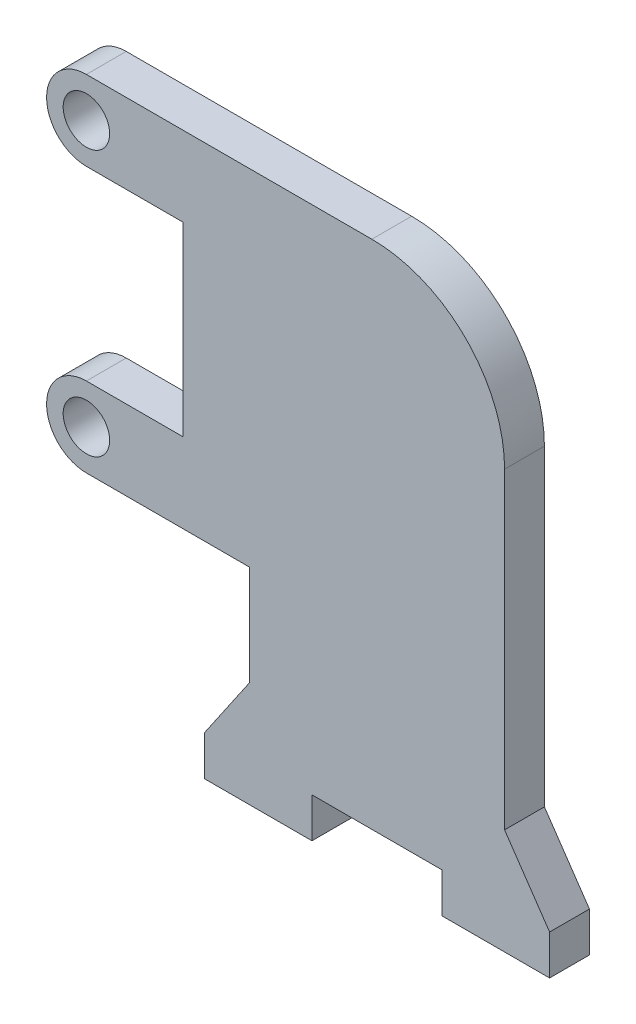
ISO-10303-21;
HEADER;
FILE_DESCRIPTION(('STEP AP214'),'2;1');
FILE_NAME('part.step','',(''),(''),'','','');
FILE_SCHEMA(('AUTOMOTIVE_DESIGN { 1 0 10303 214 1 1 1 1 }'));
ENDSEC;
DATA;
#1=APPLICATION_CONTEXT('core data for automotive mechanical design processes');
#2=APPLICATION_PROTOCOL_DEFINITION('international standard','automotive_design',2000,#1);
#3=PRODUCT_CONTEXT('',#1,'mechanical');
#4=PRODUCT('Part','Part','',(#3));
#5=PRODUCT_RELATED_PRODUCT_CATEGORY('part','',(#4));
#6=PRODUCT_DEFINITION_FORMATION('','',#4);
#7=PRODUCT_DEFINITION_CONTEXT('part definition',#1,'design');
#8=PRODUCT_DEFINITION('design','',#6,#7);
#9=PRODUCT_DEFINITION_SHAPE('','',#8);
#10=(LENGTH_UNIT() NAMED_UNIT(*) SI_UNIT(.MILLI.,.METRE.));
#11=(NAMED_UNIT(*) PLANE_ANGLE_UNIT() SI_UNIT($,.RADIAN.));
#12=(NAMED_UNIT(*) SI_UNIT($,.STERADIAN.) SOLID_ANGLE_UNIT());
#13=UNCERTAINTY_MEASURE_WITH_UNIT(LENGTH_MEASURE(1.E-05),#10,'distance_accuracy_value','');
#14=(GEOMETRIC_REPRESENTATION_CONTEXT(3) GLOBAL_UNCERTAINTY_ASSIGNED_CONTEXT((#13)) GLOBAL_UNIT_ASSIGNED_CONTEXT((#10,
#11,#12)) REPRESENTATION_CONTEXT('',''));
#15=CARTESIAN_POINT('',(0.,0.,0.));
#16=DIRECTION('',(0.,0.,1.));
#17=DIRECTION('',(1.,0.,0.));
#18=AXIS2_PLACEMENT_3D('',#15,#16,#17);
#19=CARTESIAN_POINT('',(-31.5,40.5,3.));
#20=DIRECTION('',(0.,0.,1.));
#21=DIRECTION('',(1.,0.,0.));
#22=AXIS2_PLACEMENT_3D('',#19,#20,#21);
#23=PLANE('',#22);
#24=CARTESIAN_POINT('',(-31.5,40.5,3.));
#25=DIRECTION('',(0.,0.,1.));
#26=DIRECTION('',(1.,0.,0.));
#27=AXIS2_PLACEMENT_3D('',#24,#25,#26);
#28=CIRCLE('',#27,1.75);
#29=CARTESIAN_POINT('',(-29.75,40.5,3.));
#30=VERTEX_POINT('',#29);
#31=EDGE_CURVE('E273',#30,#30,#28,.T.);
#32=ORIENTED_EDGE('',*,*,#31,.F.);
#33=EDGE_LOOP('',(#32));
#34=FACE_BOUND('',#33,.T.);
#35=DIRECTION('',(0.,1.,0.));
#36=VECTOR('',#35,1.);
#37=CARTESIAN_POINT('',(0.,43.5,3.));
#38=LINE('',#37,#36);
#39=CARTESIAN_POINT('',(0.,9.96803793212616,3.));
#40=VERTEX_POINT('',#39);
#41=CARTESIAN_POINT('',(0.,33.5,3.));
#42=VERTEX_POINT('',#41);
#43=EDGE_CURVE('E238',#40,#42,#38,.T.);
#44=ORIENTED_EDGE('',*,*,#43,.T.);
#45=CARTESIAN_POINT('',(-10.,33.5,3.));
#46=DIRECTION('',(0.,0.,1.));
#47=DIRECTION('',(1.,0.,0.));
#48=AXIS2_PLACEMENT_3D('',#45,#46,#47);
#49=CIRCLE('',#48,10.);
#50=CARTESIAN_POINT('',(-10.,43.5,3.));
#51=VERTEX_POINT('',#50);
#52=EDGE_CURVE('E11',#42,#51,#49,.T.);
#53=ORIENTED_EDGE('',*,*,#52,.T.);
#54=DIRECTION('',(-1.,0.,0.));
#55=VECTOR('',#54,1.);
#56=CARTESIAN_POINT('',(0.,43.5,3.));
#57=LINE('',#56,#55);
#58=CARTESIAN_POINT('',(-31.5,43.5,3.));
#59=VERTEX_POINT('',#58);
#60=EDGE_CURVE('E163',#51,#59,#57,.T.);
#61=ORIENTED_EDGE('',*,*,#60,.T.);
#62=CARTESIAN_POINT('',(-31.5,40.5,3.));
#63=DIRECTION('',(0.,0.,1.));
#64=DIRECTION('',(1.,0.,0.));
#65=AXIS2_PLACEMENT_3D('',#62,#63,#64);
#66=CIRCLE('',#65,3.);
#67=CARTESIAN_POINT('',(-31.5,37.5,3.));
#68=VERTEX_POINT('',#67);
#69=EDGE_CURVE('E166',#59,#68,#66,.T.);
#70=ORIENTED_EDGE('',*,*,#69,.T.);
#71=DIRECTION('',(1.,0.,0.));
#72=VECTOR('',#71,1.);
#73=CARTESIAN_POINT('',(-24.2074766361135,37.5,3.));
#74=LINE('',#73,#72);
#75=CARTESIAN_POINT('',(-24.2074766361135,37.5,3.));
#76=VERTEX_POINT('',#75);
#77=EDGE_CURVE('E182',#68,#76,#74,.T.);
#78=ORIENTED_EDGE('',*,*,#77,.T.);
#79=DIRECTION('',(0.,-1.,0.));
#80=VECTOR('',#79,1.);
#81=CARTESIAN_POINT('',(-24.2074766361135,37.5,3.));
#82=LINE('',#81,#80);
#83=CARTESIAN_POINT('',(-24.2074766361135,23.5,3.));
#84=VERTEX_POINT('',#83);
#85=EDGE_CURVE('E301',#76,#84,#82,.T.);
#86=ORIENTED_EDGE('',*,*,#85,.T.);
#87=DIRECTION('',(-1.,0.,0.));
#88=VECTOR('',#87,1.);
#89=CARTESIAN_POINT('',(-24.2074766361135,23.5,3.));
#90=LINE('',#89,#88);
#91=CARTESIAN_POINT('',(-31.5,23.5,3.));
#92=VERTEX_POINT('',#91);
#93=EDGE_CURVE('E299',#84,#92,#90,.T.);
#94=ORIENTED_EDGE('',*,*,#93,.T.);
#95=CARTESIAN_POINT('',(-31.5,20.5,3.));
#96=DIRECTION('',(0.,0.,1.));
#97=DIRECTION('',(1.,0.,0.));
#98=AXIS2_PLACEMENT_3D('',#95,#96,#97);
#99=CIRCLE('',#98,3.);
#100=CARTESIAN_POINT('',(-31.5,17.5,3.));
#101=VERTEX_POINT('',#100);
#102=EDGE_CURVE('E297',#92,#101,#99,.T.);
#103=ORIENTED_EDGE('',*,*,#102,.T.);
#104=DIRECTION('',(1.,0.,0.));
#105=VECTOR('',#104,1.);
#106=CARTESIAN_POINT('',(-31.5,17.5,3.));
#107=LINE('',#106,#105);
#108=CARTESIAN_POINT('',(-19.2101041322525,17.5,3.));
#109=VERTEX_POINT('',#108);
#110=EDGE_CURVE('E295',#101,#109,#107,.T.);
#111=ORIENTED_EDGE('',*,*,#110,.T.);
#112=DIRECTION('',(0.,-1.,0.));
#113=VECTOR('',#112,1.);
#114=CARTESIAN_POINT('',(-19.2101041322525,17.5,3.));
#115=LINE('',#114,#113);
#116=CARTESIAN_POINT('',(-19.2101041322525,9.96803793212616,3.));
#117=VERTEX_POINT('',#116);
#118=EDGE_CURVE('E293',#109,#117,#115,.T.);
#119=ORIENTED_EDGE('',*,*,#118,.T.);
#120=DIRECTION('',(-0.564776254154879,-0.825244074648697,0.));
#121=VECTOR('',#120,1.);
#122=CARTESIAN_POINT('',(-22.6101041322525,5.,3.));
#123=LINE('',#122,#121);
#124=CARTESIAN_POINT('',(-22.6101041322525,5.,3.));
#125=VERTEX_POINT('',#124);
#126=EDGE_CURVE('E291',#117,#125,#123,.T.);
#127=ORIENTED_EDGE('',*,*,#126,.T.);
#128=DIRECTION('',(0.,-1.,0.));
#129=VECTOR('',#128,1.);
#130=CARTESIAN_POINT('',(-22.6101041322525,5.,3.));
#131=LINE('',#130,#129);
#132=CARTESIAN_POINT('',(-22.6101041322525,2.,3.));
#133=VERTEX_POINT('',#132);
#134=EDGE_CURVE('E289',#125,#133,#131,.T.);
#135=ORIENTED_EDGE('',*,*,#134,.T.);
#136=DIRECTION('',(1.,0.,0.));
#137=VECTOR('',#136,1.);
#138=CARTESIAN_POINT('',(-22.6101041322525,2.,3.));
#139=LINE('',#138,#137);
#140=CARTESIAN_POINT('',(-14.5101041322525,2.,3.));
#141=VERTEX_POINT('',#140);
#142=EDGE_CURVE('E287',#133,#141,#139,.T.);
#143=ORIENTED_EDGE('',*,*,#142,.T.);
#144=DIRECTION('',(0.,1.,0.));
#145=VECTOR('',#144,1.);
#146=CARTESIAN_POINT('',(-14.5101041322525,5.,3.));
#147=LINE('',#146,#145);
#148=CARTESIAN_POINT('',(-14.5101041322525,5.,3.));
#149=VERTEX_POINT('',#148);
#150=EDGE_CURVE('E285',#141,#149,#147,.T.);
#151=ORIENTED_EDGE('',*,*,#150,.T.);
#152=DIRECTION('',(1.,0.,0.));
#153=VECTOR('',#152,1.);
#154=CARTESIAN_POINT('',(-14.5101041322525,5.,3.));
#155=LINE('',#154,#153);
#156=CARTESIAN_POINT('',(-4.71010413225247,5.,3.));
#157=VERTEX_POINT('',#156);
#158=EDGE_CURVE('E283',#149,#157,#155,.T.);
#159=ORIENTED_EDGE('',*,*,#158,.T.);
#160=DIRECTION('',(0.,-1.,0.));
#161=VECTOR('',#160,1.);
#162=CARTESIAN_POINT('',(-4.71010413225247,5.,3.));
#163=LINE('',#162,#161);
#164=CARTESIAN_POINT('',(-4.71010413225247,2.,3.));
#165=VERTEX_POINT('',#164);
#166=EDGE_CURVE('E281',#157,#165,#163,.T.);
#167=ORIENTED_EDGE('',*,*,#166,.T.);
#168=DIRECTION('',(1.,0.,0.));
#169=VECTOR('',#168,1.);
#170=CARTESIAN_POINT('',(3.38989586774753,2.,3.));
#171=LINE('',#170,#169);
#172=CARTESIAN_POINT('',(3.38989586774753,2.,3.));
#173=VERTEX_POINT('',#172);
#174=EDGE_CURVE('E279',#165,#173,#171,.T.);
#175=ORIENTED_EDGE('',*,*,#174,.T.);
#176=DIRECTION('',(0.,1.,0.));
#177=VECTOR('',#176,1.);
#178=CARTESIAN_POINT('',(3.38989586774753,5.,3.));
#179=LINE('',#178,#177);
#180=CARTESIAN_POINT('',(3.38989586774753,5.,3.));
#181=VERTEX_POINT('',#180);
#182=EDGE_CURVE('E277',#173,#181,#179,.T.);
#183=ORIENTED_EDGE('',*,*,#182,.T.);
#184=DIRECTION('',(-0.563631588100596,0.826026290680388,0.));
#185=VECTOR('',#184,1.);
#186=CARTESIAN_POINT('',(3.38989586774753,5.,3.));
#187=LINE('',#186,#185);
#188=EDGE_CURVE('E275',#181,#40,#187,.T.);
#189=ORIENTED_EDGE('',*,*,#188,.T.);
#190=EDGE_LOOP('',(#44,#53,#61,#70,#78,#86,#94,#103,#111,#119,#127,#135,#143,#151,#159,#167,
#175,#183,#189));
#191=FACE_BOUND('',#190,.T.);
#192=CARTESIAN_POINT('',(-31.5,20.5,3.));
#193=DIRECTION('',(0.,0.,1.));
#194=DIRECTION('',(1.,0.,0.));
#195=AXIS2_PLACEMENT_3D('',#192,#193,#194);
#196=CIRCLE('',#195,1.75);
#197=CARTESIAN_POINT('',(-29.75,20.5,3.));
#198=VERTEX_POINT('',#197);
#199=EDGE_CURVE('E307',#198,#198,#196,.T.);
#200=ORIENTED_EDGE('',*,*,#199,.F.);
#201=EDGE_LOOP('',(#200));
#202=FACE_BOUND('',#201,.T.);
#203=ADVANCED_FACE('F33',(#34,#191,#202),#23,.T.);
#204=CARTESIAN_POINT('',(-31.5,40.5,0.));
#205=DIRECTION('',(0.,0.,1.));
#206=DIRECTION('',(1.,0.,0.));
#207=AXIS2_PLACEMENT_3D('',#204,#205,#206);
#208=PLANE('',#207);
#209=CARTESIAN_POINT('',(-31.5,40.5,0.));
#210=DIRECTION('',(0.,0.,1.));
#211=DIRECTION('',(1.,0.,0.));
#212=AXIS2_PLACEMENT_3D('',#209,#210,#211);
#213=CIRCLE('',#212,1.75);
#214=CARTESIAN_POINT('',(-29.75,40.5,0.));
#215=VERTEX_POINT('',#214);
#216=EDGE_CURVE('E304',#215,#215,#213,.T.);
#217=ORIENTED_EDGE('',*,*,#216,.T.);
#218=EDGE_LOOP('',(#217));
#219=FACE_BOUND('',#218,.T.);
#220=DIRECTION('',(-1.,0.,0.));
#221=VECTOR('',#220,1.);
#222=CARTESIAN_POINT('',(0.,43.5,0.));
#223=LINE('',#222,#221);
#224=CARTESIAN_POINT('',(-10.,43.5,0.));
#225=VERTEX_POINT('',#224);
#226=CARTESIAN_POINT('',(-31.5,43.5,0.));
#227=VERTEX_POINT('',#226);
#228=EDGE_CURVE('E185',#225,#227,#223,.T.);
#229=ORIENTED_EDGE('',*,*,#228,.F.);
#230=CARTESIAN_POINT('',(-10.,33.5,0.));
#231=DIRECTION('',(0.,0.,1.));
#232=DIRECTION('',(1.,0.,0.));
#233=AXIS2_PLACEMENT_3D('',#230,#231,#232);
#234=CIRCLE('',#233,10.);
#235=CARTESIAN_POINT('',(0.,33.5,0.));
#236=VERTEX_POINT('',#235);
#237=EDGE_CURVE('E55',#225,#236,#234,.F.);
#238=ORIENTED_EDGE('',*,*,#237,.T.);
#239=DIRECTION('',(0.,1.,0.));
#240=VECTOR('',#239,1.);
#241=CARTESIAN_POINT('',(0.,43.5,0.));
#242=LINE('',#241,#240);
#243=CARTESIAN_POINT('',(0.,9.96803793212616,0.));
#244=VERTEX_POINT('',#243);
#245=EDGE_CURVE('E173',#244,#236,#242,.T.);
#246=ORIENTED_EDGE('',*,*,#245,.F.);
#247=DIRECTION('',(-0.563631588100596,0.826026290680388,0.));
#248=VECTOR('',#247,1.);
#249=CARTESIAN_POINT('',(3.38989586774753,5.,0.));
#250=LINE('',#249,#248);
#251=CARTESIAN_POINT('',(3.38989586774753,5.,0.));
#252=VERTEX_POINT('',#251);
#253=EDGE_CURVE('E240',#252,#244,#250,.T.);
#254=ORIENTED_EDGE('',*,*,#253,.F.);
#255=DIRECTION('',(0.,1.,0.));
#256=VECTOR('',#255,1.);
#257=CARTESIAN_POINT('',(3.38989586774753,5.,0.));
#258=LINE('',#257,#256);
#259=CARTESIAN_POINT('',(3.38989586774753,2.,0.));
#260=VERTEX_POINT('',#259);
#261=EDGE_CURVE('E242',#260,#252,#258,.T.);
#262=ORIENTED_EDGE('',*,*,#261,.F.);
#263=DIRECTION('',(1.,0.,0.));
#264=VECTOR('',#263,1.);
#265=CARTESIAN_POINT('',(3.38989586774753,2.,0.));
#266=LINE('',#265,#264);
#267=CARTESIAN_POINT('',(-4.71010413225247,2.,0.));
#268=VERTEX_POINT('',#267);
#269=EDGE_CURVE('E244',#268,#260,#266,.T.);
#270=ORIENTED_EDGE('',*,*,#269,.F.);
#271=DIRECTION('',(0.,-1.,0.));
#272=VECTOR('',#271,1.);
#273=CARTESIAN_POINT('',(-4.71010413225247,5.,0.));
#274=LINE('',#273,#272);
#275=CARTESIAN_POINT('',(-4.71010413225247,5.,0.));
#276=VERTEX_POINT('',#275);
#277=EDGE_CURVE('E246',#276,#268,#274,.T.);
#278=ORIENTED_EDGE('',*,*,#277,.F.);
#279=DIRECTION('',(1.,0.,0.));
#280=VECTOR('',#279,1.);
#281=CARTESIAN_POINT('',(-14.5101041322525,5.,0.));
#282=LINE('',#281,#280);
#283=CARTESIAN_POINT('',(-14.5101041322525,5.,0.));
#284=VERTEX_POINT('',#283);
#285=EDGE_CURVE('E248',#284,#276,#282,.T.);
#286=ORIENTED_EDGE('',*,*,#285,.F.);
#287=DIRECTION('',(0.,1.,0.));
#288=VECTOR('',#287,1.);
#289=CARTESIAN_POINT('',(-14.5101041322525,5.,0.));
#290=LINE('',#289,#288);
#291=CARTESIAN_POINT('',(-14.5101041322525,2.,0.));
#292=VERTEX_POINT('',#291);
#293=EDGE_CURVE('E250',#292,#284,#290,.T.);
#294=ORIENTED_EDGE('',*,*,#293,.F.);
#295=DIRECTION('',(1.,0.,0.));
#296=VECTOR('',#295,1.);
#297=CARTESIAN_POINT('',(-22.6101041322525,2.,0.));
#298=LINE('',#297,#296);
#299=CARTESIAN_POINT('',(-22.6101041322525,2.,0.));
#300=VERTEX_POINT('',#299);
#301=EDGE_CURVE('E252',#300,#292,#298,.T.);
#302=ORIENTED_EDGE('',*,*,#301,.F.);
#303=DIRECTION('',(0.,-1.,0.));
#304=VECTOR('',#303,1.);
#305=CARTESIAN_POINT('',(-22.6101041322525,5.,0.));
#306=LINE('',#305,#304);
#307=CARTESIAN_POINT('',(-22.6101041322525,5.,0.));
#308=VERTEX_POINT('',#307);
#309=EDGE_CURVE('E254',#308,#300,#306,.T.);
#310=ORIENTED_EDGE('',*,*,#309,.F.);
#311=DIRECTION('',(-0.564776254154879,-0.825244074648697,0.));
#312=VECTOR('',#311,1.);
#313=CARTESIAN_POINT('',(-22.6101041322525,5.,0.));
#314=LINE('',#313,#312);
#315=CARTESIAN_POINT('',(-19.2101041322525,9.96803793212616,0.));
#316=VERTEX_POINT('',#315);
#317=EDGE_CURVE('E256',#316,#308,#314,.T.);
#318=ORIENTED_EDGE('',*,*,#317,.F.);
#319=DIRECTION('',(0.,-1.,0.));
#320=VECTOR('',#319,1.);
#321=CARTESIAN_POINT('',(-19.2101041322525,17.5,0.));
#322=LINE('',#321,#320);
#323=CARTESIAN_POINT('',(-19.2101041322525,17.5,0.));
#324=VERTEX_POINT('',#323);
#325=EDGE_CURVE('E258',#324,#316,#322,.T.);
#326=ORIENTED_EDGE('',*,*,#325,.F.);
#327=DIRECTION('',(1.,0.,0.));
#328=VECTOR('',#327,1.);
#329=CARTESIAN_POINT('',(-31.5,17.5,0.));
#330=LINE('',#329,#328);
#331=CARTESIAN_POINT('',(-31.5,17.5,0.));
#332=VERTEX_POINT('',#331);
#333=EDGE_CURVE('E260',#332,#324,#330,.T.);
#334=ORIENTED_EDGE('',*,*,#333,.F.);
#335=CARTESIAN_POINT('',(-31.5,20.5,0.));
#336=DIRECTION('',(0.,0.,1.));
#337=DIRECTION('',(1.,0.,0.));
#338=AXIS2_PLACEMENT_3D('',#335,#336,#337);
#339=CIRCLE('',#338,3.);
#340=CARTESIAN_POINT('',(-31.5,23.5,0.));
#341=VERTEX_POINT('',#340);
#342=EDGE_CURVE('E262',#341,#332,#339,.T.);
#343=ORIENTED_EDGE('',*,*,#342,.F.);
#344=DIRECTION('',(-1.,0.,0.));
#345=VECTOR('',#344,1.);
#346=CARTESIAN_POINT('',(-24.2074766361135,23.5,0.));
#347=LINE('',#346,#345);
#348=CARTESIAN_POINT('',(-24.2074766361135,23.5,0.));
#349=VERTEX_POINT('',#348);
#350=EDGE_CURVE('E264',#349,#341,#347,.T.);
#351=ORIENTED_EDGE('',*,*,#350,.F.);
#352=DIRECTION('',(0.,-1.,0.));
#353=VECTOR('',#352,1.);
#354=CARTESIAN_POINT('',(-24.2074766361135,37.5,0.));
#355=LINE('',#354,#353);
#356=CARTESIAN_POINT('',(-24.2074766361135,37.5,0.));
#357=VERTEX_POINT('',#356);
#358=EDGE_CURVE('E266',#357,#349,#355,.T.);
#359=ORIENTED_EDGE('',*,*,#358,.F.);
#360=DIRECTION('',(1.,0.,0.));
#361=VECTOR('',#360,1.);
#362=CARTESIAN_POINT('',(-24.2074766361135,37.5,0.));
#363=LINE('',#362,#361);
#364=CARTESIAN_POINT('',(-31.5,37.5,0.));
#365=VERTEX_POINT('',#364);
#366=EDGE_CURVE('E268',#365,#357,#363,.T.);
#367=ORIENTED_EDGE('',*,*,#366,.F.);
#368=CARTESIAN_POINT('',(-31.5,40.5,0.));
#369=DIRECTION('',(0.,0.,1.));
#370=DIRECTION('',(1.,0.,0.));
#371=AXIS2_PLACEMENT_3D('',#368,#369,#370);
#372=CIRCLE('',#371,3.);
#373=EDGE_CURVE('E270',#227,#365,#372,.T.);
#374=ORIENTED_EDGE('',*,*,#373,.F.);
#375=EDGE_LOOP('',(#229,#238,#246,#254,#262,#270,#278,#286,#294,#302,#310,#318,#326,#334,#343,
#351,#359,#367,#374));
#376=FACE_BOUND('',#375,.T.);
#377=CARTESIAN_POINT('',(-31.5,20.5,0.));
#378=DIRECTION('',(0.,0.,1.));
#379=DIRECTION('',(1.,0.,0.));
#380=AXIS2_PLACEMENT_3D('',#377,#378,#379);
#381=CIRCLE('',#380,1.75);
#382=CARTESIAN_POINT('',(-29.75,20.5,0.));
#383=VERTEX_POINT('',#382);
#384=EDGE_CURVE('E310',#383,#383,#381,.T.);
#385=ORIENTED_EDGE('',*,*,#384,.T.);
#386=EDGE_LOOP('',(#385));
#387=FACE_BOUND('',#386,.T.);
#388=ADVANCED_FACE('F319',(#219,#376,#387),#208,.F.);
#389=CARTESIAN_POINT('',(0.,43.5,3.));
#390=DIRECTION('',(0.,-1.,0.));
#391=DIRECTION('',(1.,0.,0.));
#392=AXIS2_PLACEMENT_3D('',#389,#390,#391);
#393=PLANE('',#392);
#394=ORIENTED_EDGE('',*,*,#60,.F.);
#395=DIRECTION('',(0.,0.,-1.));
#396=VECTOR('',#395,1.);
#397=CARTESIAN_POINT('',(-10.,43.5,3.));
#398=LINE('',#397,#396);
#399=EDGE_CURVE('E187',#51,#225,#398,.T.);
#400=ORIENTED_EDGE('',*,*,#399,.T.);
#401=ORIENTED_EDGE('',*,*,#228,.T.);
#402=DIRECTION('',(0.,0.,-1.));
#403=VECTOR('',#402,1.);
#404=CARTESIAN_POINT('',(-31.5,43.5,3.));
#405=LINE('',#404,#403);
#406=EDGE_CURVE('E178',#59,#227,#405,.T.);
#407=ORIENTED_EDGE('',*,*,#406,.F.);
#408=EDGE_LOOP('',(#394,#400,#401,#407));
#409=FACE_BOUND('',#408,.T.);
#410=ADVANCED_FACE('F184',(#409),#393,.F.);
#411=CARTESIAN_POINT('',(-31.5,40.5,3.));
#412=DIRECTION('',(0.,0.,-1.));
#413=DIRECTION('',(-1.,0.,0.));
#414=AXIS2_PLACEMENT_3D('',#411,#412,#413);
#415=CYLINDRICAL_SURFACE('',#414,3.);
#416=ORIENTED_EDGE('',*,*,#373,.T.);
#417=DIRECTION('',(0.,0.,-1.));
#418=VECTOR('',#417,1.);
#419=CARTESIAN_POINT('',(-31.5,37.5,3.));
#420=LINE('',#419,#418);
#421=EDGE_CURVE('E180',#68,#365,#420,.T.);
#422=ORIENTED_EDGE('',*,*,#421,.F.);
#423=ORIENTED_EDGE('',*,*,#69,.F.);
#424=ORIENTED_EDGE('',*,*,#406,.T.);
#425=EDGE_LOOP('',(#416,#422,#423,#424));
#426=FACE_BOUND('',#425,.T.);
#427=ADVANCED_FACE('F177',(#426),#415,.T.);
#428=CARTESIAN_POINT('',(-24.2074766361135,37.5,3.));
#429=DIRECTION('',(0.,1.,0.));
#430=DIRECTION('',(-1.,0.,0.));
#431=AXIS2_PLACEMENT_3D('',#428,#429,#430);
#432=PLANE('',#431);
#433=ORIENTED_EDGE('',*,*,#366,.T.);
#434=DIRECTION('',(0.,0.,-1.));
#435=VECTOR('',#434,1.);
#436=CARTESIAN_POINT('',(-24.2074766361135,37.5,3.));
#437=LINE('',#436,#435);
#438=EDGE_CURVE('E190',#76,#357,#437,.T.);
#439=ORIENTED_EDGE('',*,*,#438,.F.);
#440=ORIENTED_EDGE('',*,*,#77,.F.);
#441=ORIENTED_EDGE('',*,*,#421,.T.);
#442=EDGE_LOOP('',(#433,#439,#440,#441));
#443=FACE_BOUND('',#442,.T.);
#444=ADVANCED_FACE('F390',(#443),#432,.F.);
#445=CARTESIAN_POINT('',(-24.2074766361135,37.5,3.));
#446=DIRECTION('',(1.,0.,0.));
#447=DIRECTION('',(0.,0.,-1.));
#448=AXIS2_PLACEMENT_3D('',#445,#446,#447);
#449=PLANE('',#448);
#450=ORIENTED_EDGE('',*,*,#358,.T.);
#451=DIRECTION('',(0.,0.,-1.));
#452=VECTOR('',#451,1.);
#453=CARTESIAN_POINT('',(-24.2074766361135,23.5,3.));
#454=LINE('',#453,#452);
#455=EDGE_CURVE('E196',#84,#349,#454,.T.);
#456=ORIENTED_EDGE('',*,*,#455,.F.);
#457=ORIENTED_EDGE('',*,*,#85,.F.);
#458=ORIENTED_EDGE('',*,*,#438,.T.);
#459=EDGE_LOOP('',(#450,#456,#457,#458));
#460=FACE_BOUND('',#459,.T.);
#461=ADVANCED_FACE('F386',(#460),#449,.F.);
#462=CARTESIAN_POINT('',(-24.2074766361135,23.5,3.));
#463=DIRECTION('',(0.,-1.,0.));
#464=DIRECTION('',(0.,0.,-1.));
#465=AXIS2_PLACEMENT_3D('',#462,#463,#464);
#466=PLANE('',#465);
#467=ORIENTED_EDGE('',*,*,#350,.T.);
#468=DIRECTION('',(0.,0.,-1.));
#469=VECTOR('',#468,1.);
#470=CARTESIAN_POINT('',(-31.5,23.5,3.));
#471=LINE('',#470,#469);
#472=EDGE_CURVE('E199',#92,#341,#471,.T.);
#473=ORIENTED_EDGE('',*,*,#472,.F.);
#474=ORIENTED_EDGE('',*,*,#93,.F.);
#475=ORIENTED_EDGE('',*,*,#455,.T.);
#476=EDGE_LOOP('',(#467,#473,#474,#475));
#477=FACE_BOUND('',#476,.T.);
#478=ADVANCED_FACE('F382',(#477),#466,.F.);
#479=CARTESIAN_POINT('',(-31.5,20.5,3.));
#480=DIRECTION('',(0.,0.,-1.));
#481=DIRECTION('',(-1.,0.,0.));
#482=AXIS2_PLACEMENT_3D('',#479,#480,#481);
#483=CYLINDRICAL_SURFACE('',#482,3.);
#484=ORIENTED_EDGE('',*,*,#342,.T.);
#485=DIRECTION('',(0.,0.,-1.));
#486=VECTOR('',#485,1.);
#487=CARTESIAN_POINT('',(-31.5,17.5,3.));
#488=LINE('',#487,#486);
#489=EDGE_CURVE('E202',#101,#332,#488,.T.);
#490=ORIENTED_EDGE('',*,*,#489,.F.);
#491=ORIENTED_EDGE('',*,*,#102,.F.);
#492=ORIENTED_EDGE('',*,*,#472,.T.);
#493=EDGE_LOOP('',(#484,#490,#491,#492));
#494=FACE_BOUND('',#493,.T.);
#495=ADVANCED_FACE('F378',(#494),#483,.T.);
#496=CARTESIAN_POINT('',(-31.5,17.5,3.));
#497=DIRECTION('',(0.,1.,0.));
#498=DIRECTION('',(0.,0.,1.));
#499=AXIS2_PLACEMENT_3D('',#496,#497,#498);
#500=PLANE('',#499);
#501=ORIENTED_EDGE('',*,*,#333,.T.);
#502=DIRECTION('',(0.,0.,-1.));
#503=VECTOR('',#502,1.);
#504=CARTESIAN_POINT('',(-19.2101041322525,17.5,3.));
#505=LINE('',#504,#503);
#506=EDGE_CURVE('E205',#109,#324,#505,.T.);
#507=ORIENTED_EDGE('',*,*,#506,.F.);
#508=ORIENTED_EDGE('',*,*,#110,.F.);
#509=ORIENTED_EDGE('',*,*,#489,.T.);
#510=EDGE_LOOP('',(#501,#507,#508,#509));
#511=FACE_BOUND('',#510,.T.);
#512=ADVANCED_FACE('F374',(#511),#500,.F.);
#513=CARTESIAN_POINT('',(-19.2101041322525,17.5,3.));
#514=DIRECTION('',(1.,0.,0.));
#515=DIRECTION('',(0.,1.,0.));
#516=AXIS2_PLACEMENT_3D('',#513,#514,#515);
#517=PLANE('',#516);
#518=ORIENTED_EDGE('',*,*,#325,.T.);
#519=DIRECTION('',(0.,0.,-1.));
#520=VECTOR('',#519,1.);
#521=CARTESIAN_POINT('',(-19.2101041322525,9.96803793212616,3.));
#522=LINE('',#521,#520);
#523=EDGE_CURVE('E208',#117,#316,#522,.T.);
#524=ORIENTED_EDGE('',*,*,#523,.F.);
#525=ORIENTED_EDGE('',*,*,#118,.F.);
#526=ORIENTED_EDGE('',*,*,#506,.T.);
#527=EDGE_LOOP('',(#518,#524,#525,#526));
#528=FACE_BOUND('',#527,.T.);
#529=ADVANCED_FACE('F370',(#528),#517,.F.);
#530=CARTESIAN_POINT('',(-22.6101041322525,5.,3.));
#531=DIRECTION('',(0.825244074648696,-0.564776254154879,0.));
#532=DIRECTION('',(0.564776254154879,0.825244074648697,0.));
#533=AXIS2_PLACEMENT_3D('',#530,#531,#532);
#534=PLANE('',#533);
#535=ORIENTED_EDGE('',*,*,#317,.T.);
#536=DIRECTION('',(0.,0.,-1.));
#537=VECTOR('',#536,1.);
#538=CARTESIAN_POINT('',(-22.6101041322525,5.,3.));
#539=LINE('',#538,#537);
#540=EDGE_CURVE('E211',#125,#308,#539,.T.);
#541=ORIENTED_EDGE('',*,*,#540,.F.);
#542=ORIENTED_EDGE('',*,*,#126,.F.);
#543=ORIENTED_EDGE('',*,*,#523,.T.);
#544=EDGE_LOOP('',(#535,#541,#542,#543));
#545=FACE_BOUND('',#544,.T.);
#546=ADVANCED_FACE('F366',(#545),#534,.F.);
#547=CARTESIAN_POINT('',(-22.6101041322525,5.,3.));
#548=DIRECTION('',(1.,0.,0.));
#549=DIRECTION('',(0.,0.,-1.));
#550=AXIS2_PLACEMENT_3D('',#547,#548,#549);
#551=PLANE('',#550);
#552=ORIENTED_EDGE('',*,*,#309,.T.);
#553=DIRECTION('',(0.,0.,-1.));
#554=VECTOR('',#553,1.);
#555=CARTESIAN_POINT('',(-22.6101041322525,2.,3.));
#556=LINE('',#555,#554);
#557=EDGE_CURVE('E214',#133,#300,#556,.T.);
#558=ORIENTED_EDGE('',*,*,#557,.F.);
#559=ORIENTED_EDGE('',*,*,#134,.F.);
#560=ORIENTED_EDGE('',*,*,#540,.T.);
#561=EDGE_LOOP('',(#552,#558,#559,#560));
#562=FACE_BOUND('',#561,.T.);
#563=ADVANCED_FACE('F362',(#562),#551,.F.);
#564=CARTESIAN_POINT('',(-22.6101041322525,2.,3.));
#565=DIRECTION('',(0.,1.,0.));
#566=DIRECTION('',(0.,0.,1.));
#567=AXIS2_PLACEMENT_3D('',#564,#565,#566);
#568=PLANE('',#567);
#569=ORIENTED_EDGE('',*,*,#301,.T.);
#570=DIRECTION('',(0.,0.,-1.));
#571=VECTOR('',#570,1.);
#572=CARTESIAN_POINT('',(-14.5101041322525,2.,3.));
#573=LINE('',#572,#571);
#574=EDGE_CURVE('E217',#141,#292,#573,.T.);
#575=ORIENTED_EDGE('',*,*,#574,.F.);
#576=ORIENTED_EDGE('',*,*,#142,.F.);
#577=ORIENTED_EDGE('',*,*,#557,.T.);
#578=EDGE_LOOP('',(#569,#575,#576,#577));
#579=FACE_BOUND('',#578,.T.);
#580=ADVANCED_FACE('F358',(#579),#568,.F.);
#581=CARTESIAN_POINT('',(-14.5101041322525,5.,3.));
#582=DIRECTION('',(-1.,0.,0.));
#583=DIRECTION('',(0.,0.,1.));
#584=AXIS2_PLACEMENT_3D('',#581,#582,#583);
#585=PLANE('',#584);
#586=ORIENTED_EDGE('',*,*,#293,.T.);
#587=DIRECTION('',(0.,0.,-1.));
#588=VECTOR('',#587,1.);
#589=CARTESIAN_POINT('',(-14.5101041322525,5.,3.));
#590=LINE('',#589,#588);
#591=EDGE_CURVE('E220',#149,#284,#590,.T.);
#592=ORIENTED_EDGE('',*,*,#591,.F.);
#593=ORIENTED_EDGE('',*,*,#150,.F.);
#594=ORIENTED_EDGE('',*,*,#574,.T.);
#595=EDGE_LOOP('',(#586,#592,#593,#594));
#596=FACE_BOUND('',#595,.T.);
#597=ADVANCED_FACE('F354',(#596),#585,.F.);
#598=CARTESIAN_POINT('',(-14.5101041322525,5.,3.));
#599=DIRECTION('',(0.,1.,0.));
#600=DIRECTION('',(-1.,0.,0.));
#601=AXIS2_PLACEMENT_3D('',#598,#599,#600);
#602=PLANE('',#601);
#603=ORIENTED_EDGE('',*,*,#285,.T.);
#604=DIRECTION('',(0.,0.,-1.));
#605=VECTOR('',#604,1.);
#606=CARTESIAN_POINT('',(-4.71010413225247,5.,3.));
#607=LINE('',#606,#605);
#608=EDGE_CURVE('E223',#157,#276,#607,.T.);
#609=ORIENTED_EDGE('',*,*,#608,.F.);
#610=ORIENTED_EDGE('',*,*,#158,.F.);
#611=ORIENTED_EDGE('',*,*,#591,.T.);
#612=EDGE_LOOP('',(#603,#609,#610,#611));
#613=FACE_BOUND('',#612,.T.);
#614=ADVANCED_FACE('F350',(#613),#602,.F.);
#615=CARTESIAN_POINT('',(-4.71010413225247,5.,3.));
#616=DIRECTION('',(1.,0.,0.));
#617=DIRECTION('',(0.,1.,0.));
#618=AXIS2_PLACEMENT_3D('',#615,#616,#617);
#619=PLANE('',#618);
#620=ORIENTED_EDGE('',*,*,#277,.T.);
#621=DIRECTION('',(0.,0.,-1.));
#622=VECTOR('',#621,1.);
#623=CARTESIAN_POINT('',(-4.71010413225247,2.,3.));
#624=LINE('',#623,#622);
#625=EDGE_CURVE('E226',#165,#268,#624,.T.);
#626=ORIENTED_EDGE('',*,*,#625,.F.);
#627=ORIENTED_EDGE('',*,*,#166,.F.);
#628=ORIENTED_EDGE('',*,*,#608,.T.);
#629=EDGE_LOOP('',(#620,#626,#627,#628));
#630=FACE_BOUND('',#629,.T.);
#631=ADVANCED_FACE('F346',(#630),#619,.F.);
#632=CARTESIAN_POINT('',(3.38989586774753,2.,3.));
#633=DIRECTION('',(0.,1.,0.));
#634=DIRECTION('',(-1.,0.,0.));
#635=AXIS2_PLACEMENT_3D('',#632,#633,#634);
#636=PLANE('',#635);
#637=ORIENTED_EDGE('',*,*,#269,.T.);
#638=DIRECTION('',(0.,0.,-1.));
#639=VECTOR('',#638,1.);
#640=CARTESIAN_POINT('',(3.38989586774753,2.,3.));
#641=LINE('',#640,#639);
#642=EDGE_CURVE('E229',#173,#260,#641,.T.);
#643=ORIENTED_EDGE('',*,*,#642,.F.);
#644=ORIENTED_EDGE('',*,*,#174,.F.);
#645=ORIENTED_EDGE('',*,*,#625,.T.);
#646=EDGE_LOOP('',(#637,#643,#644,#645));
#647=FACE_BOUND('',#646,.T.);
#648=ADVANCED_FACE('F342',(#647),#636,.F.);
#649=CARTESIAN_POINT('',(3.38989586774753,5.,3.));
#650=DIRECTION('',(-1.,0.,0.));
#651=DIRECTION('',(0.,-1.,0.));
#652=AXIS2_PLACEMENT_3D('',#649,#650,#651);
#653=PLANE('',#652);
#654=ORIENTED_EDGE('',*,*,#261,.T.);
#655=DIRECTION('',(0.,0.,-1.));
#656=VECTOR('',#655,1.);
#657=CARTESIAN_POINT('',(3.38989586774753,5.,3.));
#658=LINE('',#657,#656);
#659=EDGE_CURVE('E232',#181,#252,#658,.T.);
#660=ORIENTED_EDGE('',*,*,#659,.F.);
#661=ORIENTED_EDGE('',*,*,#182,.F.);
#662=ORIENTED_EDGE('',*,*,#642,.T.);
#663=EDGE_LOOP('',(#654,#660,#661,#662));
#664=FACE_BOUND('',#663,.T.);
#665=ADVANCED_FACE('F338',(#664),#653,.F.);
#666=CARTESIAN_POINT('',(3.38989586774753,5.,3.));
#667=DIRECTION('',(-0.826026290680387,-0.563631588100596,0.));
#668=DIRECTION('',(0.563631588100596,-0.826026290680388,0.));
#669=AXIS2_PLACEMENT_3D('',#666,#667,#668);
#670=PLANE('',#669);
#671=ORIENTED_EDGE('',*,*,#253,.T.);
#672=DIRECTION('',(0.,0.,-1.));
#673=VECTOR('',#672,1.);
#674=CARTESIAN_POINT('',(0.,9.96803793212616,3.));
#675=LINE('',#674,#673);
#676=EDGE_CURVE('E235',#40,#244,#675,.T.);
#677=ORIENTED_EDGE('',*,*,#676,.F.);
#678=ORIENTED_EDGE('',*,*,#188,.F.);
#679=ORIENTED_EDGE('',*,*,#659,.T.);
#680=EDGE_LOOP('',(#671,#677,#678,#679));
#681=FACE_BOUND('',#680,.T.);
#682=ADVANCED_FACE('F335',(#681),#670,.F.);
#683=CARTESIAN_POINT('',(0.,43.5,3.));
#684=DIRECTION('',(-1.,0.,0.));
#685=DIRECTION('',(0.,-1.,0.));
#686=AXIS2_PLACEMENT_3D('',#683,#684,#685);
#687=PLANE('',#686);
#688=ORIENTED_EDGE('',*,*,#245,.T.);
#689=DIRECTION('',(0.,0.,-1.));
#690=VECTOR('',#689,1.);
#691=CARTESIAN_POINT('',(0.,33.5,3.));
#692=LINE('',#691,#690);
#693=EDGE_CURVE('E41',#236,#42,#692,.F.);
#694=ORIENTED_EDGE('',*,*,#693,.T.);
#695=ORIENTED_EDGE('',*,*,#43,.F.);
#696=ORIENTED_EDGE('',*,*,#676,.T.);
#697=EDGE_LOOP('',(#688,#694,#695,#696));
#698=FACE_BOUND('',#697,.T.);
#699=ADVANCED_FACE('F332',(#698),#687,.F.);
#700=CARTESIAN_POINT('',(-31.5,40.5,3.));
#701=DIRECTION('',(0.,0.,-1.));
#702=DIRECTION('',(-1.,0.,0.));
#703=AXIS2_PLACEMENT_3D('',#700,#701,#702);
#704=CYLINDRICAL_SURFACE('',#703,1.75);
#705=ORIENTED_EDGE('',*,*,#31,.T.);
#706=EDGE_LOOP('',(#705));
#707=FACE_BOUND('',#706,.T.);
#708=ORIENTED_EDGE('',*,*,#216,.F.);
#709=EDGE_LOOP('',(#708));
#710=FACE_BOUND('',#709,.T.);
#711=ADVANCED_FACE('F329',(#707,#710),#704,.F.);
#712=CARTESIAN_POINT('',(-31.5,20.5,3.));
#713=DIRECTION('',(0.,0.,-1.));
#714=DIRECTION('',(-1.,0.,0.));
#715=AXIS2_PLACEMENT_3D('',#712,#713,#714);
#716=CYLINDRICAL_SURFACE('',#715,1.75);
#717=ORIENTED_EDGE('',*,*,#199,.T.);
#718=EDGE_LOOP('',(#717));
#719=FACE_BOUND('',#718,.T.);
#720=ORIENTED_EDGE('',*,*,#384,.F.);
#721=EDGE_LOOP('',(#720));
#722=FACE_BOUND('',#721,.T.);
#723=ADVANCED_FACE('F316',(#719,#722),#716,.F.);
#724=CARTESIAN_POINT('',(-10.,33.5,3.));
#725=DIRECTION('',(0.,0.,-1.));
#726=DIRECTION('',(-1.,0.,0.));
#727=AXIS2_PLACEMENT_3D('',#724,#725,#726);
#728=CYLINDRICAL_SURFACE('',#727,10.);
#729=ORIENTED_EDGE('',*,*,#52,.F.);
#730=ORIENTED_EDGE('',*,*,#693,.F.);
#731=ORIENTED_EDGE('',*,*,#237,.F.);
#732=ORIENTED_EDGE('',*,*,#399,.F.);
#733=EDGE_LOOP('',(#729,#730,#731,#732));
#734=FACE_BOUND('',#733,.T.);
#735=ADVANCED_FACE('F35',(#734),#728,.T.);
#736=CLOSED_SHELL('',(#203,#388,#410,#427,#444,#461,#478,#495,#512,#529,#546,#563,#580,#597,
#614,#631,#648,#665,#682,#699,#711,#723,#735));
#737=MANIFOLD_SOLID_BREP('B2',#736);
#738=ADVANCED_BREP_SHAPE_REPRESENTATION('',(#18,#737),#14);
#739=SHAPE_DEFINITION_REPRESENTATION(#9,#738);
ENDSEC;
END-ISO-10303-21;
